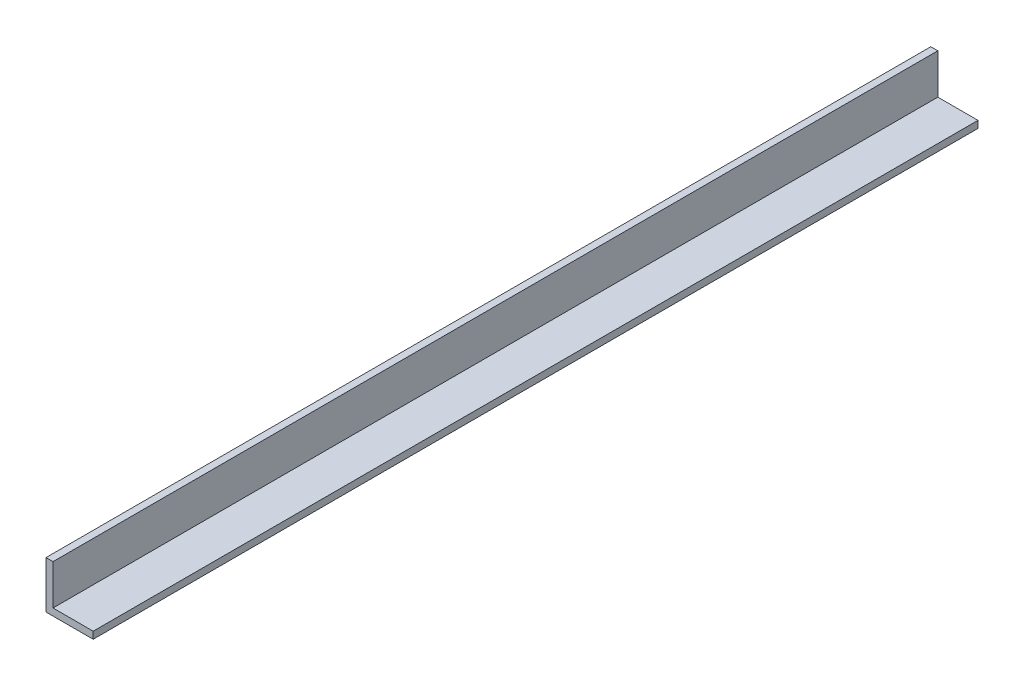
ISO-10303-21;
HEADER;
FILE_DESCRIPTION(('STEP AP214'),'2;1');
FILE_NAME('part.step','',(''),(''),'','','');
FILE_SCHEMA(('AUTOMOTIVE_DESIGN { 1 0 10303 214 1 1 1 1 }'));
ENDSEC;
DATA;
#1=APPLICATION_CONTEXT('core data for automotive mechanical design processes');
#2=APPLICATION_PROTOCOL_DEFINITION('international standard','automotive_design',2000,#1);
#3=PRODUCT_CONTEXT('',#1,'mechanical');
#4=PRODUCT('Part','Part','',(#3));
#5=PRODUCT_RELATED_PRODUCT_CATEGORY('part','',(#4));
#6=PRODUCT_DEFINITION_FORMATION('','',#4);
#7=PRODUCT_DEFINITION_CONTEXT('part definition',#1,'design');
#8=PRODUCT_DEFINITION('design','',#6,#7);
#9=PRODUCT_DEFINITION_SHAPE('','',#8);
#10=(LENGTH_UNIT() NAMED_UNIT(*) SI_UNIT(.MILLI.,.METRE.));
#11=(NAMED_UNIT(*) PLANE_ANGLE_UNIT() SI_UNIT($,.RADIAN.));
#12=(NAMED_UNIT(*) SI_UNIT($,.STERADIAN.) SOLID_ANGLE_UNIT());
#13=UNCERTAINTY_MEASURE_WITH_UNIT(LENGTH_MEASURE(1.E-05),#10,'distance_accuracy_value','');
#14=(GEOMETRIC_REPRESENTATION_CONTEXT(3) GLOBAL_UNCERTAINTY_ASSIGNED_CONTEXT((#13)) GLOBAL_UNIT_ASSIGNED_CONTEXT((#10,
#11,#12)) REPRESENTATION_CONTEXT('',''));
#15=CARTESIAN_POINT('',(0.,0.,0.));
#16=DIRECTION('',(0.,0.,1.));
#17=DIRECTION('',(1.,0.,0.));
#18=AXIS2_PLACEMENT_3D('',#15,#16,#17);
#19=CARTESIAN_POINT('',(27.2375,0.,300.));
#20=DIRECTION('',(0.,-1.,0.));
#21=DIRECTION('',(1.,0.,0.));
#22=AXIS2_PLACEMENT_3D('',#19,#20,#21);
#23=PLANE('',#22);
#24=DIRECTION('',(-1.,0.,0.));
#25=VECTOR('',#24,1.);
#26=CARTESIAN_POINT('',(27.2375,0.,-300.));
#27=LINE('',#26,#25);
#28=CARTESIAN_POINT('',(27.2375,0.,-300.));
#29=VERTEX_POINT('',#28);
#30=CARTESIAN_POINT('',(0.,0.,-300.));
#31=VERTEX_POINT('',#30);
#32=EDGE_CURVE('E128',#29,#31,#27,.T.);
#33=ORIENTED_EDGE('',*,*,#32,.T.);
#34=DIRECTION('',(0.,0.,-1.));
#35=VECTOR('',#34,1.);
#36=CARTESIAN_POINT('',(0.,0.,300.));
#37=LINE('',#36,#35);
#38=CARTESIAN_POINT('',(0.,0.,300.));
#39=VERTEX_POINT('',#38);
#40=EDGE_CURVE('E11',#39,#31,#37,.T.);
#41=ORIENTED_EDGE('',*,*,#40,.F.);
#42=DIRECTION('',(-1.,0.,0.));
#43=VECTOR('',#42,1.);
#44=CARTESIAN_POINT('',(27.2375,0.,300.));
#45=LINE('',#44,#43);
#46=CARTESIAN_POINT('',(27.2375,0.,300.));
#47=VERTEX_POINT('',#46);
#48=EDGE_CURVE('E144',#47,#39,#45,.T.);
#49=ORIENTED_EDGE('',*,*,#48,.F.);
#50=DIRECTION('',(0.,0.,-1.));
#51=VECTOR('',#50,1.);
#52=CARTESIAN_POINT('',(27.2375,0.,300.));
#53=LINE('',#52,#51);
#54=EDGE_CURVE('E124',#47,#29,#53,.T.);
#55=ORIENTED_EDGE('',*,*,#54,.T.);
#56=EDGE_LOOP('',(#33,#41,#49,#55));
#57=FACE_BOUND('',#56,.T.);
#58=ADVANCED_FACE('F39',(#57),#23,.F.);
#59=CARTESIAN_POINT('',(0.,0.,300.));
#60=DIRECTION('',(-1.,0.,0.));
#61=DIRECTION('',(0.,-1.,0.));
#62=AXIS2_PLACEMENT_3D('',#59,#60,#61);
#63=PLANE('',#62);
#64=DIRECTION('',(0.,1.,0.));
#65=VECTOR('',#64,1.);
#66=CARTESIAN_POINT('',(0.,0.,-300.));
#67=LINE('',#66,#65);
#68=CARTESIAN_POINT('',(0.,27.24,-300.));
#69=VERTEX_POINT('',#68);
#70=EDGE_CURVE('E132',#31,#69,#67,.T.);
#71=ORIENTED_EDGE('',*,*,#70,.T.);
#72=DIRECTION('',(0.,0.,-1.));
#73=VECTOR('',#72,1.);
#74=CARTESIAN_POINT('',(0.,27.24,300.));
#75=LINE('',#74,#73);
#76=CARTESIAN_POINT('',(0.,27.24,300.));
#77=VERTEX_POINT('',#76);
#78=EDGE_CURVE('E48',#77,#69,#75,.T.);
#79=ORIENTED_EDGE('',*,*,#78,.F.);
#80=DIRECTION('',(0.,1.,0.));
#81=VECTOR('',#80,1.);
#82=CARTESIAN_POINT('',(0.,0.,300.));
#83=LINE('',#82,#81);
#84=EDGE_CURVE('E93',#39,#77,#83,.T.);
#85=ORIENTED_EDGE('',*,*,#84,.F.);
#86=ORIENTED_EDGE('',*,*,#40,.T.);
#87=EDGE_LOOP('',(#71,#79,#85,#86));
#88=FACE_BOUND('',#87,.T.);
#89=ADVANCED_FACE('F172',(#88),#63,.F.);
#90=CARTESIAN_POINT('',(0.,27.24,300.));
#91=DIRECTION('',(0.,-1.,0.));
#92=DIRECTION('',(0.,0.,-1.));
#93=AXIS2_PLACEMENT_3D('',#90,#91,#92);
#94=PLANE('',#93);
#95=DIRECTION('',(-1.,0.,0.));
#96=VECTOR('',#95,1.);
#97=CARTESIAN_POINT('',(0.,27.24,-300.));
#98=LINE('',#97,#96);
#99=CARTESIAN_POINT('',(-4.7625,27.24,-300.));
#100=VERTEX_POINT('',#99);
#101=EDGE_CURVE('E135',#69,#100,#98,.T.);
#102=ORIENTED_EDGE('',*,*,#101,.T.);
#103=DIRECTION('',(0.,0.,-1.));
#104=VECTOR('',#103,1.);
#105=CARTESIAN_POINT('',(-4.7625,27.24,300.));
#106=LINE('',#105,#104);
#107=CARTESIAN_POINT('',(-4.7625,27.24,300.));
#108=VERTEX_POINT('',#107);
#109=EDGE_CURVE('E117',#108,#100,#106,.T.);
#110=ORIENTED_EDGE('',*,*,#109,.F.);
#111=DIRECTION('',(-1.,0.,0.));
#112=VECTOR('',#111,1.);
#113=CARTESIAN_POINT('',(0.,27.24,300.));
#114=LINE('',#113,#112);
#115=EDGE_CURVE('E106',#77,#108,#114,.T.);
#116=ORIENTED_EDGE('',*,*,#115,.F.);
#117=ORIENTED_EDGE('',*,*,#78,.T.);
#118=EDGE_LOOP('',(#102,#110,#116,#117));
#119=FACE_BOUND('',#118,.T.);
#120=ADVANCED_FACE('F154',(#119),#94,.F.);
#121=CARTESIAN_POINT('',(-4.7625,27.24,300.));
#122=DIRECTION('',(1.,0.,0.));
#123=DIRECTION('',(0.,0.,-1.));
#124=AXIS2_PLACEMENT_3D('',#121,#122,#123);
#125=PLANE('',#124);
#126=DIRECTION('',(0.,-1.,0.));
#127=VECTOR('',#126,1.);
#128=CARTESIAN_POINT('',(-4.7625,27.24,-300.));
#129=LINE('',#128,#127);
#130=CARTESIAN_POINT('',(-4.7625,-4.76000000000001,-300.));
#131=VERTEX_POINT('',#130);
#132=EDGE_CURVE('E115',#100,#131,#129,.T.);
#133=ORIENTED_EDGE('',*,*,#132,.T.);
#134=DIRECTION('',(0.,0.,-1.));
#135=VECTOR('',#134,1.);
#136=CARTESIAN_POINT('',(-4.7625,-4.76000000000001,300.));
#137=LINE('',#136,#135);
#138=CARTESIAN_POINT('',(-4.7625,-4.76000000000001,300.));
#139=VERTEX_POINT('',#138);
#140=EDGE_CURVE('E112',#139,#131,#137,.T.);
#141=ORIENTED_EDGE('',*,*,#140,.F.);
#142=DIRECTION('',(0.,-1.,0.));
#143=VECTOR('',#142,1.);
#144=CARTESIAN_POINT('',(-4.7625,27.24,300.));
#145=LINE('',#144,#143);
#146=EDGE_CURVE('E100',#108,#139,#145,.T.);
#147=ORIENTED_EDGE('',*,*,#146,.F.);
#148=ORIENTED_EDGE('',*,*,#109,.T.);
#149=EDGE_LOOP('',(#133,#141,#147,#148));
#150=FACE_BOUND('',#149,.T.);
#151=ADVANCED_FACE('F113',(#150),#125,.F.);
#152=CARTESIAN_POINT('',(-4.7625,-4.76000000000001,300.));
#153=DIRECTION('',(0.,1.,0.));
#154=DIRECTION('',(-1.,0.,0.));
#155=AXIS2_PLACEMENT_3D('',#152,#153,#154);
#156=PLANE('',#155);
#157=DIRECTION('',(1.,0.,0.));
#158=VECTOR('',#157,1.);
#159=CARTESIAN_POINT('',(-4.7625,-4.76000000000001,-300.));
#160=LINE('',#159,#158);
#161=CARTESIAN_POINT('',(27.2375,-4.76,-300.));
#162=VERTEX_POINT('',#161);
#163=EDGE_CURVE('E79',#131,#162,#160,.T.);
#164=ORIENTED_EDGE('',*,*,#163,.T.);
#165=DIRECTION('',(0.,0.,-1.));
#166=VECTOR('',#165,1.);
#167=CARTESIAN_POINT('',(27.2375,-4.76,300.));
#168=LINE('',#167,#166);
#169=CARTESIAN_POINT('',(27.2375,-4.76,300.));
#170=VERTEX_POINT('',#169);
#171=EDGE_CURVE('E118',#170,#162,#168,.T.);
#172=ORIENTED_EDGE('',*,*,#171,.F.);
#173=DIRECTION('',(1.,0.,0.));
#174=VECTOR('',#173,1.);
#175=CARTESIAN_POINT('',(-4.7625,-4.76000000000001,300.));
#176=LINE('',#175,#174);
#177=EDGE_CURVE('E104',#139,#170,#176,.T.);
#178=ORIENTED_EDGE('',*,*,#177,.F.);
#179=ORIENTED_EDGE('',*,*,#140,.T.);
#180=EDGE_LOOP('',(#164,#172,#178,#179));
#181=FACE_BOUND('',#180,.T.);
#182=ADVANCED_FACE('F120',(#181),#156,.F.);
#183=CARTESIAN_POINT('',(27.2375,-4.76,300.));
#184=DIRECTION('',(-1.,0.,0.));
#185=DIRECTION('',(0.,0.,1.));
#186=AXIS2_PLACEMENT_3D('',#183,#184,#185);
#187=PLANE('',#186);
#188=DIRECTION('',(0.,1.,0.));
#189=VECTOR('',#188,1.);
#190=CARTESIAN_POINT('',(27.2375,-4.76,-300.));
#191=LINE('',#190,#189);
#192=EDGE_CURVE('E85',#162,#29,#191,.T.);
#193=ORIENTED_EDGE('',*,*,#192,.T.);
#194=ORIENTED_EDGE('',*,*,#54,.F.);
#195=DIRECTION('',(0.,1.,0.));
#196=VECTOR('',#195,1.);
#197=CARTESIAN_POINT('',(27.2375,-4.76,300.));
#198=LINE('',#197,#196);
#199=EDGE_CURVE('E56',#170,#47,#198,.T.);
#200=ORIENTED_EDGE('',*,*,#199,.F.);
#201=ORIENTED_EDGE('',*,*,#171,.T.);
#202=EDGE_LOOP('',(#193,#194,#200,#201));
#203=FACE_BOUND('',#202,.T.);
#204=ADVANCED_FACE('F161',(#203),#187,.F.);
#205=CARTESIAN_POINT('',(0.,0.,300.));
#206=DIRECTION('',(0.,0.,-1.));
#207=DIRECTION('',(-1.,0.,0.));
#208=AXIS2_PLACEMENT_3D('',#205,#206,#207);
#209=PLANE('',#208);
#210=ORIENTED_EDGE('',*,*,#48,.T.);
#211=ORIENTED_EDGE('',*,*,#84,.T.);
#212=ORIENTED_EDGE('',*,*,#115,.T.);
#213=ORIENTED_EDGE('',*,*,#146,.T.);
#214=ORIENTED_EDGE('',*,*,#177,.T.);
#215=ORIENTED_EDGE('',*,*,#199,.T.);
#216=EDGE_LOOP('',(#210,#211,#212,#213,#214,#215));
#217=FACE_BOUND('',#216,.T.);
#218=ADVANCED_FACE('F102',(#217),#209,.F.);
#219=CARTESIAN_POINT('',(0.,0.,-300.));
#220=DIRECTION('',(0.,0.,-1.));
#221=DIRECTION('',(-1.,0.,0.));
#222=AXIS2_PLACEMENT_3D('',#219,#220,#221);
#223=PLANE('',#222);
#224=ORIENTED_EDGE('',*,*,#32,.F.);
#225=ORIENTED_EDGE('',*,*,#192,.F.);
#226=ORIENTED_EDGE('',*,*,#163,.F.);
#227=ORIENTED_EDGE('',*,*,#132,.F.);
#228=ORIENTED_EDGE('',*,*,#101,.F.);
#229=ORIENTED_EDGE('',*,*,#70,.F.);
#230=EDGE_LOOP('',(#224,#225,#226,#227,#228,#229));
#231=FACE_BOUND('',#230,.T.);
#232=ADVANCED_FACE('F157',(#231),#223,.T.);
#233=CLOSED_SHELL('',(#58,#89,#120,#151,#182,#204,#218,#232));
#234=MANIFOLD_SOLID_BREP('B2',#233);
#235=ADVANCED_BREP_SHAPE_REPRESENTATION('',(#18,#234),#14);
#236=SHAPE_DEFINITION_REPRESENTATION(#9,#235);
ENDSEC;
END-ISO-10303-21;
